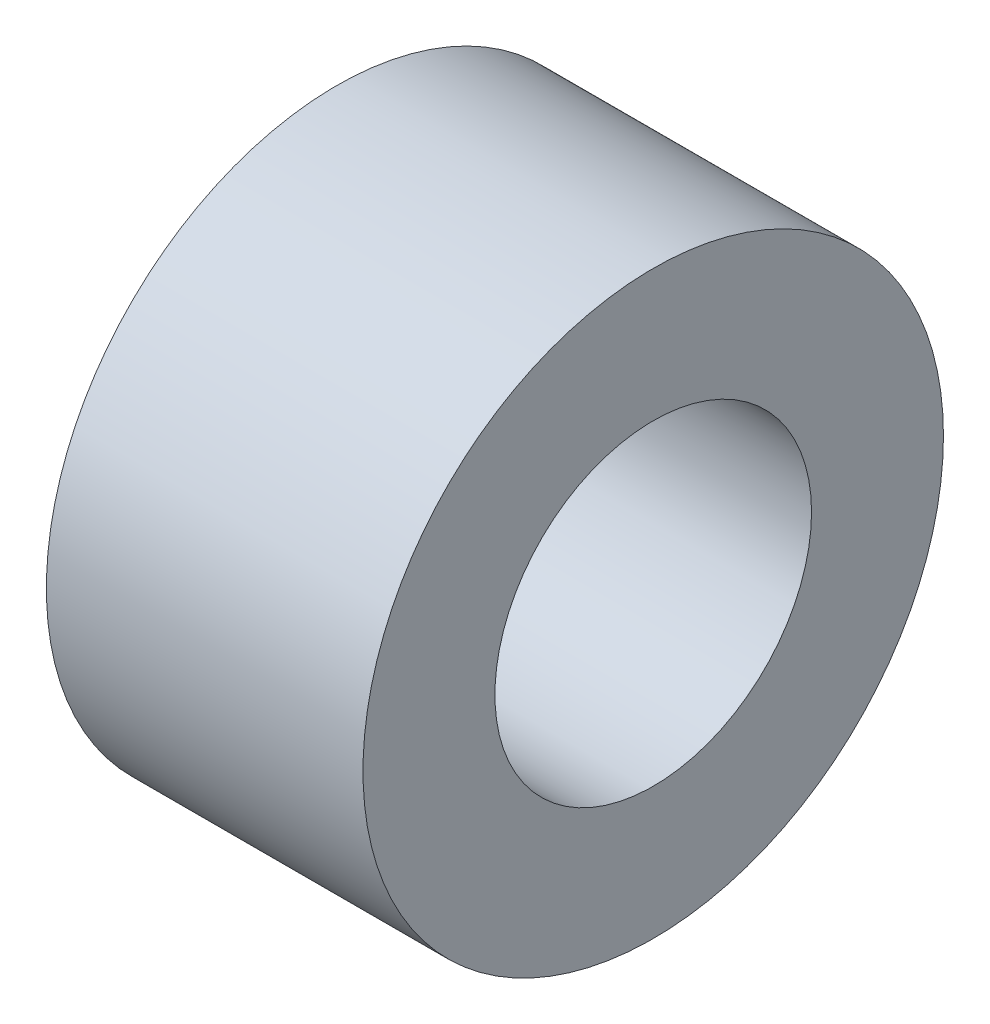
ISO-10303-21;
HEADER;
FILE_DESCRIPTION(('STEP AP214'),'2;1');
FILE_NAME('part.step','',(''),(''),'','','');
FILE_SCHEMA(('AUTOMOTIVE_DESIGN { 1 0 10303 214 1 1 1 1 }'));
ENDSEC;
DATA;
#1=APPLICATION_CONTEXT('core data for automotive mechanical design processes');
#2=APPLICATION_PROTOCOL_DEFINITION('international standard','automotive_design',2000,#1);
#3=PRODUCT_CONTEXT('',#1,'mechanical');
#4=PRODUCT('Part','Part','',(#3));
#5=PRODUCT_RELATED_PRODUCT_CATEGORY('part','',(#4));
#6=PRODUCT_DEFINITION_FORMATION('','',#4);
#7=PRODUCT_DEFINITION_CONTEXT('part definition',#1,'design');
#8=PRODUCT_DEFINITION('design','',#6,#7);
#9=PRODUCT_DEFINITION_SHAPE('','',#8);
#10=(LENGTH_UNIT() NAMED_UNIT(*) SI_UNIT(.MILLI.,.METRE.));
#11=(NAMED_UNIT(*) PLANE_ANGLE_UNIT() SI_UNIT($,.RADIAN.));
#12=(NAMED_UNIT(*) SI_UNIT($,.STERADIAN.) SOLID_ANGLE_UNIT());
#13=UNCERTAINTY_MEASURE_WITH_UNIT(LENGTH_MEASURE(1.E-05),#10,'distance_accuracy_value','');
#14=(GEOMETRIC_REPRESENTATION_CONTEXT(3) GLOBAL_UNCERTAINTY_ASSIGNED_CONTEXT((#13)) GLOBAL_UNIT_ASSIGNED_CONTEXT((#10,
#11,#12)) REPRESENTATION_CONTEXT('',''));
#15=CARTESIAN_POINT('',(0.,0.,0.));
#16=DIRECTION('',(0.,0.,1.));
#17=DIRECTION('',(1.,0.,0.));
#18=AXIS2_PLACEMENT_3D('',#15,#16,#17);
#19=CARTESIAN_POINT('',(6.,0.,0.));
#20=DIRECTION('',(1.,0.,0.));
#21=DIRECTION('',(0.,0.,-1.));
#22=AXIS2_PLACEMENT_3D('',#19,#20,#21);
#23=PLANE('',#22);
#24=CARTESIAN_POINT('',(6.,0.,0.));
#25=DIRECTION('',(1.,0.,0.));
#26=DIRECTION('',(0.,0.,-1.));
#27=AXIS2_PLACEMENT_3D('',#24,#25,#26);
#28=CIRCLE('',#27,5.5);
#29=CARTESIAN_POINT('',(6.,0.,-5.5));
#30=VERTEX_POINT('',#29);
#31=EDGE_CURVE('E10',#30,#30,#28,.T.);
#32=ORIENTED_EDGE('',*,*,#31,.T.);
#33=EDGE_LOOP('',(#32));
#34=FACE_BOUND('',#33,.T.);
#35=CARTESIAN_POINT('',(6.,0.,0.));
#36=DIRECTION('',(1.,0.,0.));
#37=DIRECTION('',(0.,0.,-1.));
#38=AXIS2_PLACEMENT_3D('',#35,#36,#37);
#39=CIRCLE('',#38,3.);
#40=CARTESIAN_POINT('',(6.,0.,-3.));
#41=VERTEX_POINT('',#40);
#42=EDGE_CURVE('E44',#41,#41,#39,.T.);
#43=ORIENTED_EDGE('',*,*,#42,.F.);
#44=EDGE_LOOP('',(#43));
#45=FACE_BOUND('',#44,.T.);
#46=ADVANCED_FACE('F33',(#34,#45),#23,.T.);
#47=CARTESIAN_POINT('',(0.,0.,0.));
#48=DIRECTION('',(1.,0.,0.));
#49=DIRECTION('',(0.,0.,-1.));
#50=AXIS2_PLACEMENT_3D('',#47,#48,#49);
#51=PLANE('',#50);
#52=CARTESIAN_POINT('',(0.,0.,0.));
#53=DIRECTION('',(1.,0.,0.));
#54=DIRECTION('',(0.,0.,-1.));
#55=AXIS2_PLACEMENT_3D('',#52,#53,#54);
#56=CIRCLE('',#55,5.5);
#57=CARTESIAN_POINT('',(0.,0.,-5.5));
#58=VERTEX_POINT('',#57);
#59=EDGE_CURVE('E37',#58,#58,#56,.T.);
#60=ORIENTED_EDGE('',*,*,#59,.F.);
#61=EDGE_LOOP('',(#60));
#62=FACE_BOUND('',#61,.T.);
#63=CARTESIAN_POINT('',(0.,0.,0.));
#64=DIRECTION('',(1.,0.,0.));
#65=DIRECTION('',(0.,0.,-1.));
#66=AXIS2_PLACEMENT_3D('',#63,#64,#65);
#67=CIRCLE('',#66,3.);
#68=CARTESIAN_POINT('',(0.,0.,-3.));
#69=VERTEX_POINT('',#68);
#70=EDGE_CURVE('E46',#69,#69,#67,.T.);
#71=ORIENTED_EDGE('',*,*,#70,.T.);
#72=EDGE_LOOP('',(#71));
#73=FACE_BOUND('',#72,.T.);
#74=ADVANCED_FACE('F56',(#62,#73),#51,.F.);
#75=CARTESIAN_POINT('',(6.,0.,0.));
#76=DIRECTION('',(-1.,0.,0.));
#77=DIRECTION('',(0.,0.,1.));
#78=AXIS2_PLACEMENT_3D('',#75,#76,#77);
#79=CYLINDRICAL_SURFACE('',#78,5.5);
#80=ORIENTED_EDGE('',*,*,#31,.F.);
#81=EDGE_LOOP('',(#80));
#82=FACE_BOUND('',#81,.T.);
#83=ORIENTED_EDGE('',*,*,#59,.T.);
#84=EDGE_LOOP('',(#83));
#85=FACE_BOUND('',#84,.T.);
#86=ADVANCED_FACE('F35',(#82,#85),#79,.T.);
#87=CARTESIAN_POINT('',(6.,0.,0.));
#88=DIRECTION('',(-1.,0.,0.));
#89=DIRECTION('',(0.,0.,1.));
#90=AXIS2_PLACEMENT_3D('',#87,#88,#89);
#91=CYLINDRICAL_SURFACE('',#90,3.);
#92=ORIENTED_EDGE('',*,*,#42,.T.);
#93=EDGE_LOOP('',(#92));
#94=FACE_BOUND('',#93,.T.);
#95=ORIENTED_EDGE('',*,*,#70,.F.);
#96=EDGE_LOOP('',(#95));
#97=FACE_BOUND('',#96,.T.);
#98=ADVANCED_FACE('F52',(#94,#97),#91,.F.);
#99=CLOSED_SHELL('',(#46,#74,#86,#98));
#100=MANIFOLD_SOLID_BREP('B2',#99);
#101=ADVANCED_BREP_SHAPE_REPRESENTATION('',(#18,#100),#14);
#102=SHAPE_DEFINITION_REPRESENTATION(#9,#101);
ENDSEC;
END-ISO-10303-21;
